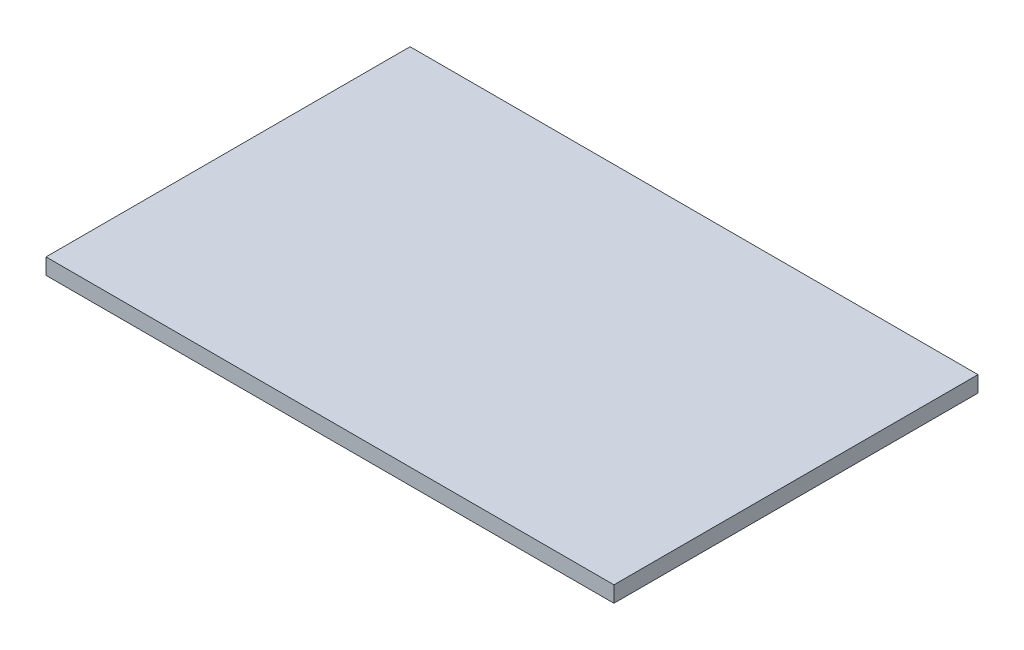
ISO-10303-21;
HEADER;
FILE_DESCRIPTION(('STEP AP214'),'2;1');
FILE_NAME('part.step','',(''),(''),'','','');
FILE_SCHEMA(('AUTOMOTIVE_DESIGN { 1 0 10303 214 1 1 1 1 }'));
ENDSEC;
DATA;
#1=APPLICATION_CONTEXT('core data for automotive mechanical design processes');
#2=APPLICATION_PROTOCOL_DEFINITION('international standard','automotive_design',2000,#1);
#3=PRODUCT_CONTEXT('',#1,'mechanical');
#4=PRODUCT('Part','Part','',(#3));
#5=PRODUCT_RELATED_PRODUCT_CATEGORY('part','',(#4));
#6=PRODUCT_DEFINITION_FORMATION('','',#4);
#7=PRODUCT_DEFINITION_CONTEXT('part definition',#1,'design');
#8=PRODUCT_DEFINITION('design','',#6,#7);
#9=PRODUCT_DEFINITION_SHAPE('','',#8);
#10=(LENGTH_UNIT() NAMED_UNIT(*) SI_UNIT(.MILLI.,.METRE.));
#11=(NAMED_UNIT(*) PLANE_ANGLE_UNIT() SI_UNIT($,.RADIAN.));
#12=(NAMED_UNIT(*) SI_UNIT($,.STERADIAN.) SOLID_ANGLE_UNIT());
#13=UNCERTAINTY_MEASURE_WITH_UNIT(LENGTH_MEASURE(1.E-05),#10,'distance_accuracy_value','');
#14=(GEOMETRIC_REPRESENTATION_CONTEXT(3) GLOBAL_UNCERTAINTY_ASSIGNED_CONTEXT((#13)) GLOBAL_UNIT_ASSIGNED_CONTEXT((#10,
#11,#12)) REPRESENTATION_CONTEXT('',''));
#15=CARTESIAN_POINT('',(0.,0.,0.));
#16=DIRECTION('',(0.,0.,1.));
#17=DIRECTION('',(1.,0.,0.));
#18=AXIS2_PLACEMENT_3D('',#15,#16,#17);
#19=CARTESIAN_POINT('',(0.,1.1,0.));
#20=DIRECTION('',(1.,0.,0.));
#21=DIRECTION('',(0.,0.,-1.));
#22=AXIS2_PLACEMENT_3D('',#19,#20,#21);
#23=PLANE('',#22);
#24=DIRECTION('',(0.,0.,1.));
#25=VECTOR('',#24,1.);
#26=CARTESIAN_POINT('',(0.,0.,0.));
#27=LINE('',#26,#25);
#28=CARTESIAN_POINT('',(0.,0.,-25.));
#29=VERTEX_POINT('',#28);
#30=CARTESIAN_POINT('',(0.,0.,0.));
#31=VERTEX_POINT('',#30);
#32=EDGE_CURVE('E102',#29,#31,#27,.T.);
#33=ORIENTED_EDGE('',*,*,#32,.T.);
#34=DIRECTION('',(0.,-1.,0.));
#35=VECTOR('',#34,1.);
#36=CARTESIAN_POINT('',(0.,1.1,0.));
#37=LINE('',#36,#35);
#38=CARTESIAN_POINT('',(0.,1.1,0.));
#39=VERTEX_POINT('',#38);
#40=EDGE_CURVE('E11',#39,#31,#37,.T.);
#41=ORIENTED_EDGE('',*,*,#40,.F.);
#42=DIRECTION('',(0.,0.,1.));
#43=VECTOR('',#42,1.);
#44=CARTESIAN_POINT('',(0.,1.1,0.));
#45=LINE('',#44,#43);
#46=CARTESIAN_POINT('',(0.,1.1,-25.));
#47=VERTEX_POINT('',#46);
#48=EDGE_CURVE('E90',#47,#39,#45,.T.);
#49=ORIENTED_EDGE('',*,*,#48,.F.);
#50=DIRECTION('',(0.,-1.,0.));
#51=VECTOR('',#50,1.);
#52=CARTESIAN_POINT('',(0.,1.1,-25.));
#53=LINE('',#52,#51);
#54=EDGE_CURVE('E98',#47,#29,#53,.T.);
#55=ORIENTED_EDGE('',*,*,#54,.T.);
#56=EDGE_LOOP('',(#33,#41,#49,#55));
#57=FACE_BOUND('',#56,.T.);
#58=ADVANCED_FACE('F39',(#57),#23,.F.);
#59=CARTESIAN_POINT('',(0.,1.1,0.));
#60=DIRECTION('',(0.,0.,-1.));
#61=DIRECTION('',(-1.,0.,0.));
#62=AXIS2_PLACEMENT_3D('',#59,#60,#61);
#63=PLANE('',#62);
#64=DIRECTION('',(1.,0.,0.));
#65=VECTOR('',#64,1.);
#66=CARTESIAN_POINT('',(0.,0.,0.));
#67=LINE('',#66,#65);
#68=CARTESIAN_POINT('',(39.,0.,0.));
#69=VERTEX_POINT('',#68);
#70=EDGE_CURVE('E94',#31,#69,#67,.T.);
#71=ORIENTED_EDGE('',*,*,#70,.T.);
#72=DIRECTION('',(0.,-1.,0.));
#73=VECTOR('',#72,1.);
#74=CARTESIAN_POINT('',(39.,1.1,0.));
#75=LINE('',#74,#73);
#76=CARTESIAN_POINT('',(39.,1.1,0.));
#77=VERTEX_POINT('',#76);
#78=EDGE_CURVE('E47',#77,#69,#75,.T.);
#79=ORIENTED_EDGE('',*,*,#78,.F.);
#80=DIRECTION('',(1.,0.,0.));
#81=VECTOR('',#80,1.);
#82=CARTESIAN_POINT('',(0.,1.1,0.));
#83=LINE('',#82,#81);
#84=EDGE_CURVE('E85',#39,#77,#83,.T.);
#85=ORIENTED_EDGE('',*,*,#84,.F.);
#86=ORIENTED_EDGE('',*,*,#40,.T.);
#87=EDGE_LOOP('',(#71,#79,#85,#86));
#88=FACE_BOUND('',#87,.T.);
#89=ADVANCED_FACE('F93',(#88),#63,.F.);
#90=CARTESIAN_POINT('',(39.,1.1,0.));
#91=DIRECTION('',(-1.,0.,0.));
#92=DIRECTION('',(0.,0.,1.));
#93=AXIS2_PLACEMENT_3D('',#90,#91,#92);
#94=PLANE('',#93);
#95=DIRECTION('',(0.,0.,-1.));
#96=VECTOR('',#95,1.);
#97=CARTESIAN_POINT('',(39.,0.,0.));
#98=LINE('',#97,#96);
#99=CARTESIAN_POINT('',(39.,0.,-25.));
#100=VERTEX_POINT('',#99);
#101=EDGE_CURVE('E72',#69,#100,#98,.T.);
#102=ORIENTED_EDGE('',*,*,#101,.T.);
#103=DIRECTION('',(0.,-1.,0.));
#104=VECTOR('',#103,1.);
#105=CARTESIAN_POINT('',(39.,1.1,-25.));
#106=LINE('',#105,#104);
#107=CARTESIAN_POINT('',(39.,1.1,-25.));
#108=VERTEX_POINT('',#107);
#109=EDGE_CURVE('E95',#108,#100,#106,.T.);
#110=ORIENTED_EDGE('',*,*,#109,.F.);
#111=DIRECTION('',(0.,0.,-1.));
#112=VECTOR('',#111,1.);
#113=CARTESIAN_POINT('',(39.,1.1,0.));
#114=LINE('',#113,#112);
#115=EDGE_CURVE('E88',#77,#108,#114,.T.);
#116=ORIENTED_EDGE('',*,*,#115,.F.);
#117=ORIENTED_EDGE('',*,*,#78,.T.);
#118=EDGE_LOOP('',(#102,#110,#116,#117));
#119=FACE_BOUND('',#118,.T.);
#120=ADVANCED_FACE('F96',(#119),#94,.F.);
#121=CARTESIAN_POINT('',(0.,1.1,-25.));
#122=DIRECTION('',(0.,0.,1.));
#123=DIRECTION('',(1.,0.,0.));
#124=AXIS2_PLACEMENT_3D('',#121,#122,#123);
#125=PLANE('',#124);
#126=DIRECTION('',(-1.,0.,0.));
#127=VECTOR('',#126,1.);
#128=CARTESIAN_POINT('',(0.,0.,-25.));
#129=LINE('',#128,#127);
#130=EDGE_CURVE('E78',#100,#29,#129,.T.);
#131=ORIENTED_EDGE('',*,*,#130,.T.);
#132=ORIENTED_EDGE('',*,*,#54,.F.);
#133=DIRECTION('',(-1.,0.,0.));
#134=VECTOR('',#133,1.);
#135=CARTESIAN_POINT('',(0.,1.1,-25.));
#136=LINE('',#135,#134);
#137=EDGE_CURVE('E55',#108,#47,#136,.T.);
#138=ORIENTED_EDGE('',*,*,#137,.F.);
#139=ORIENTED_EDGE('',*,*,#109,.T.);
#140=EDGE_LOOP('',(#131,#132,#138,#139));
#141=FACE_BOUND('',#140,.T.);
#142=ADVANCED_FACE('F109',(#141),#125,.F.);
#143=CARTESIAN_POINT('',(0.,1.1,0.));
#144=DIRECTION('',(0.,-1.,0.));
#145=DIRECTION('',(0.,0.,-1.));
#146=AXIS2_PLACEMENT_3D('',#143,#144,#145);
#147=PLANE('',#146);
#148=ORIENTED_EDGE('',*,*,#48,.T.);
#149=ORIENTED_EDGE('',*,*,#84,.T.);
#150=ORIENTED_EDGE('',*,*,#115,.T.);
#151=ORIENTED_EDGE('',*,*,#137,.T.);
#152=EDGE_LOOP('',(#148,#149,#150,#151));
#153=FACE_BOUND('',#152,.T.);
#154=ADVANCED_FACE('F86',(#153),#147,.F.);
#155=CARTESIAN_POINT('',(0.,0.,0.));
#156=DIRECTION('',(0.,-1.,0.));
#157=DIRECTION('',(0.,0.,-1.));
#158=AXIS2_PLACEMENT_3D('',#155,#156,#157);
#159=PLANE('',#158);
#160=ORIENTED_EDGE('',*,*,#32,.F.);
#161=ORIENTED_EDGE('',*,*,#130,.F.);
#162=ORIENTED_EDGE('',*,*,#101,.F.);
#163=ORIENTED_EDGE('',*,*,#70,.F.);
#164=EDGE_LOOP('',(#160,#161,#162,#163));
#165=FACE_BOUND('',#164,.T.);
#166=ADVANCED_FACE('F112',(#165),#159,.T.);
#167=CLOSED_SHELL('',(#58,#89,#120,#142,#154,#166));
#168=MANIFOLD_SOLID_BREP('B2',#167);
#169=ADVANCED_BREP_SHAPE_REPRESENTATION('',(#18,#168),#14);
#170=SHAPE_DEFINITION_REPRESENTATION(#9,#169);
ENDSEC;
END-ISO-10303-21;
